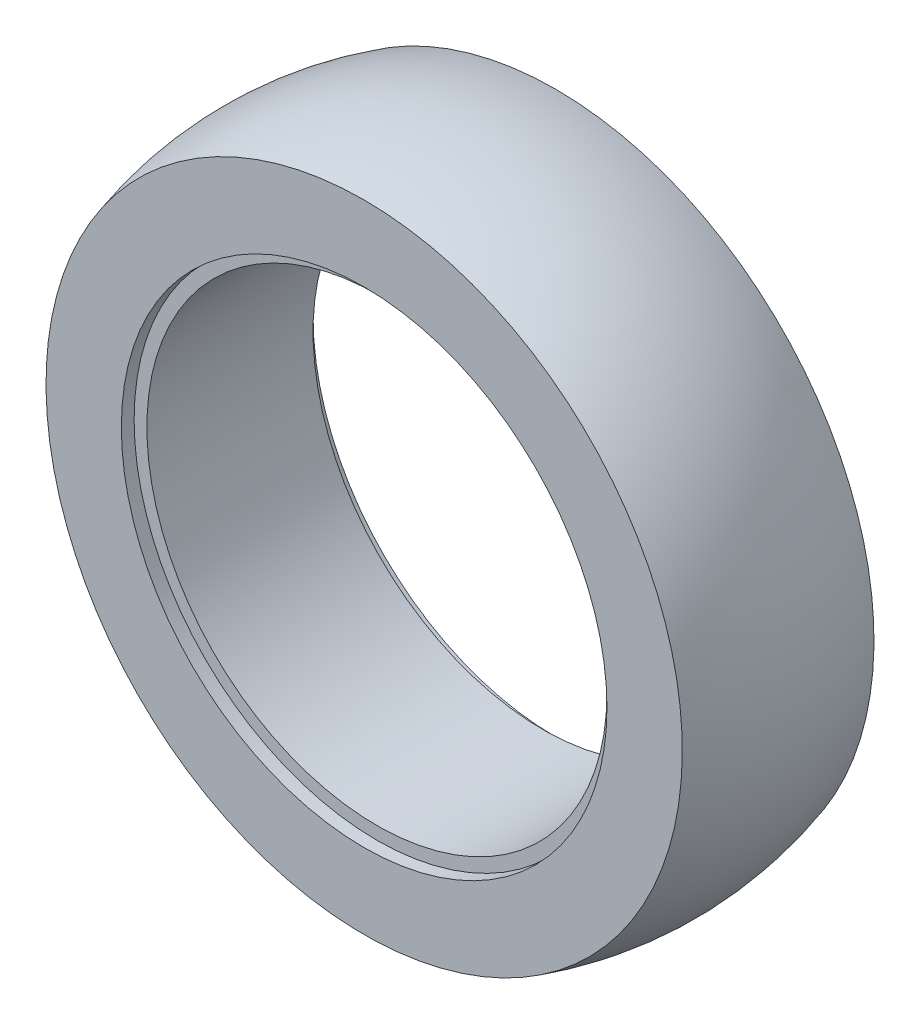
ISO-10303-21;
HEADER;
FILE_DESCRIPTION(('STEP AP214'),'2;1');
FILE_NAME('part.step','',(''),(''),'','','');
FILE_SCHEMA(('AUTOMOTIVE_DESIGN { 1 0 10303 214 1 1 1 1 }'));
ENDSEC;
DATA;
#1=APPLICATION_CONTEXT('core data for automotive mechanical design processes');
#2=APPLICATION_PROTOCOL_DEFINITION('international standard','automotive_design',2000,#1);
#3=PRODUCT_CONTEXT('',#1,'mechanical');
#4=PRODUCT('Part','Part','',(#3));
#5=PRODUCT_RELATED_PRODUCT_CATEGORY('part','',(#4));
#6=PRODUCT_DEFINITION_FORMATION('','',#4);
#7=PRODUCT_DEFINITION_CONTEXT('part definition',#1,'design');
#8=PRODUCT_DEFINITION('design','',#6,#7);
#9=PRODUCT_DEFINITION_SHAPE('','',#8);
#10=(LENGTH_UNIT() NAMED_UNIT(*) SI_UNIT(.MILLI.,.METRE.));
#11=(NAMED_UNIT(*) PLANE_ANGLE_UNIT() SI_UNIT($,.RADIAN.));
#12=(NAMED_UNIT(*) SI_UNIT($,.STERADIAN.) SOLID_ANGLE_UNIT());
#13=UNCERTAINTY_MEASURE_WITH_UNIT(LENGTH_MEASURE(1.E-05),#10,'distance_accuracy_value','');
#14=(GEOMETRIC_REPRESENTATION_CONTEXT(3) GLOBAL_UNCERTAINTY_ASSIGNED_CONTEXT((#13)) GLOBAL_UNIT_ASSIGNED_CONTEXT((#10,
#11,#12)) REPRESENTATION_CONTEXT('',''));
#15=CARTESIAN_POINT('',(0.,0.,0.));
#16=DIRECTION('',(0.,0.,1.));
#17=DIRECTION('',(1.,0.,0.));
#18=AXIS2_PLACEMENT_3D('',#15,#16,#17);
#19=CARTESIAN_POINT('',(0.,0.,0.));
#20=DIRECTION('',(0.,0.,0.999999999999999));
#21=DIRECTION('',(0.,1.,0.));
#22=AXIS2_PLACEMENT_3D('',#19,#20,#21);
#23=SPHERICAL_SURFACE('',#22,26.);
#24=CARTESIAN_POINT('',(0.,0.,7.49999999999995));
#25=DIRECTION('',(0.,0.,0.999999999999999));
#26=DIRECTION('',(1.,0.,0.));
#27=AXIS2_PLACEMENT_3D('',#24,#25,#26);
#28=CIRCLE('',#27,24.8947785690092);
#29=CARTESIAN_POINT('',(0.,24.8947785690092,7.49999999999995));
#30=VERTEX_POINT('',#29);
#31=EDGE_CURVE('E10',#30,#30,#28,.T.);
#32=CARTESIAN_POINT('',(0.,0.,-7.49999999999995));
#33=DIRECTION('',(0.,0.,0.999999999999999));
#34=DIRECTION('',(1.,0.,0.));
#35=AXIS2_PLACEMENT_3D('',#32,#33,#34);
#36=CIRCLE('',#35,24.8947785690092);
#37=CARTESIAN_POINT('',(0.,24.8947785690092,-7.49999999999995));
#38=VERTEX_POINT('',#37);
#39=EDGE_CURVE('E56',#38,#38,#36,.T.);
#40=CARTESIAN_POINT('',(0.,24.8947785690092,7.49999999999995));
#41=CARTESIAN_POINT('',(0.,24.9405005624031,7.34823541659987));
#42=CARTESIAN_POINT('',(0.,24.9848344356426,7.19605264278492));
#43=CARTESIAN_POINT('',(0.,25.0707118495896,6.89090182178894));
#44=CARTESIAN_POINT('',(0.,25.112255390297,6.73793377460791));
#45=CARTESIAN_POINT('',(0.,25.1925380469559,6.43126351434347));
#46=CARTESIAN_POINT('',(0.,25.2312771629074,6.27756130126005));
#47=CARTESIAN_POINT('',(0.,25.3059380658932,5.96947413258634));
#48=CARTESIAN_POINT('',(0.,25.3418598529275,5.81508917699606));
#49=CARTESIAN_POINT('',(0.,25.4108740692184,5.50568815620254));
#50=CARTESIAN_POINT('',(0.,25.4439664984751,5.35067209099931));
#51=CARTESIAN_POINT('',(0.,25.5073109346353,5.04006070001283));
#52=CARTESIAN_POINT('',(0.,25.5375629415389,4.88446537422957));
#53=CARTESIAN_POINT('',(0.,25.5952164136379,4.57274750350638));
#54=CARTESIAN_POINT('',(0.,25.6226178788333,4.41662495856644));
#55=CARTESIAN_POINT('',(0.,25.674561102866,4.10390486765412));
#56=CARTESIAN_POINT('',(0.,25.6991028617033,3.94730732168173));
#57=CARTESIAN_POINT('',(0.,25.7453184645055,3.63368960560432));
#58=CARTESIAN_POINT('',(0.,25.7669923084704,3.47666943549931));
#59=CARTESIAN_POINT('',(0.,25.8074648323331,3.16225898943693));
#60=CARTESIAN_POINT('',(0.,25.8262635122307,3.00486871347956));
#61=CARTESIAN_POINT('',(0.,25.8609794203904,2.68977069777443));
#62=CARTESIAN_POINT('',(0.,25.8768966486524,2.53206295802668));
#63=CARTESIAN_POINT('',(0.,25.9058443297334,2.21638276298621));
#64=CARTESIAN_POINT('',(0.,25.9188747825523,2.0584103076935));
#65=CARTESIAN_POINT('',(0.,25.9420445544729,1.74225351834703));
#66=CARTESIAN_POINT('',(0.,25.9521838735745,1.58406918429326));
#67=CARTESIAN_POINT('',(0.,25.9695679867793,1.26754154507543));
#68=CARTESIAN_POINT('',(0.,25.9768127808826,1.10919823991137));
#69=CARTESIAN_POINT('',(0.,25.9884054209364,0.792405619294494));
#70=CARTESIAN_POINT('',(0.,25.992753266887,0.633956303841675));
#71=CARTESIAN_POINT('',(0.,25.9985505564188,0.317004658925903));
#72=CARTESIAN_POINT('',(0.,26.,0.158502329462952));
#73=CARTESIAN_POINT('',(0.,26.,-0.158502329462952));
#74=CARTESIAN_POINT('',(0.,25.9985505564188,-0.317004658925903));
#75=CARTESIAN_POINT('',(0.,25.992753266887,-0.633956303841675));
#76=CARTESIAN_POINT('',(0.,25.9884054209364,-0.792405619294494));
#77=CARTESIAN_POINT('',(0.,25.9768127808826,-1.10919823991137));
#78=CARTESIAN_POINT('',(0.,25.9695679867793,-1.26754154507543));
#79=CARTESIAN_POINT('',(0.,25.9521838735745,-1.58406918429326));
#80=CARTESIAN_POINT('',(0.,25.9420445544729,-1.74225351834703));
#81=CARTESIAN_POINT('',(0.,25.9188747825523,-2.0584103076935));
#82=CARTESIAN_POINT('',(0.,25.9058443297334,-2.21638276298621));
#83=CARTESIAN_POINT('',(0.,25.8768966486524,-2.53206295802668));
#84=CARTESIAN_POINT('',(0.,25.8609794203904,-2.68977069777443));
#85=CARTESIAN_POINT('',(0.,25.8262635122307,-3.00486871347956));
#86=CARTESIAN_POINT('',(0.,25.8074648323331,-3.16225898943693));
#87=CARTESIAN_POINT('',(0.,25.7669923084704,-3.47666943549931));
#88=CARTESIAN_POINT('',(0.,25.7453184645055,-3.63368960560432));
#89=CARTESIAN_POINT('',(0.,25.6991028617033,-3.94730732168173));
#90=CARTESIAN_POINT('',(0.,25.674561102866,-4.10390486765412));
#91=CARTESIAN_POINT('',(0.,25.6226178788333,-4.41662495856644));
#92=CARTESIAN_POINT('',(0.,25.5952164136379,-4.57274750350638));
#93=CARTESIAN_POINT('',(0.,25.5375629415389,-4.88446537422957));
#94=CARTESIAN_POINT('',(0.,25.5073109346353,-5.04006070001283));
#95=CARTESIAN_POINT('',(0.,25.4439664984751,-5.35067209099931));
#96=CARTESIAN_POINT('',(0.,25.4108740692184,-5.50568815620254));
#97=CARTESIAN_POINT('',(0.,25.3418598529275,-5.81508917699606));
#98=CARTESIAN_POINT('',(0.,25.3059380658932,-5.96947413258634));
#99=CARTESIAN_POINT('',(0.,25.2312771629074,-6.27756130126005));
#100=CARTESIAN_POINT('',(0.,25.1925380469559,-6.43126351434347));
#101=CARTESIAN_POINT('',(0.,25.112255390297,-6.73793377460791));
#102=CARTESIAN_POINT('',(0.,25.0707118495896,-6.89090182178894));
#103=CARTESIAN_POINT('',(0.,24.9848344356426,-7.19605264278492));
#104=CARTESIAN_POINT('',(0.,24.9405005624031,-7.34823541659987));
#105=CARTESIAN_POINT('',(0.,24.8947785690092,-7.49999999999995));
#106=B_SPLINE_CURVE_WITH_KNOTS('',3,(#40,#41,#42,#43,#44,#45,#46,#47,#48,#49,#50,#51,#52,#53,
#54,#55,#56,#57,#58,#59,#60,#61,#62,#63,#64,#65,#66,#67,#68,#69,#70,#71,#72,#73,#74,#75,#76,#77,
#78,#79,#80,#81,#82,#83,#84,#85,#86,#87,#88,#89,#90,#91,#92,#93,#94,#95,#96,#97,#98,#99,#100,
#101,#102,#103,#104,#105),.UNSPECIFIED.,.F.,.F.,(4,2,2,2,2,2,2,2,2,2,2,2,2,2,2,2,2,2,2,2,2,2,2,
2,2,2,2,2,2,2,2,2,4),(0.,0.475500361776134,0.951000723552268,1.4265010853284,1.90200144710453,
2.37750180888067,2.8530021706568,3.32850253243294,3.80400289420907,4.2795032559852,
4.75500361776134,5.23050397953747,5.70600434131361,6.18150470308974,6.65700506486587,
7.132505426642,7.60800578841814,8.08350615019427,8.5590065119704,9.03450687374654,
9.51000723552267,9.98550759729881,10.4610079590749,10.9365083208511,11.4120086826272,
11.8875090444033,12.3630094061795,12.8385097679556,13.3140101297317,13.7895104915079,
14.265010853284,14.7405112150601,15.2160115768363),.UNSPECIFIED.);
#107=EDGE_CURVE('BSEAM28',#30,#38,#106,.T.);
#108=ORIENTED_EDGE('',*,*,#31,.F.);
#109=ORIENTED_EDGE('',*,*,#39,.T.);
#110=ORIENTED_EDGE('',*,*,#107,.T.);
#111=ORIENTED_EDGE('',*,*,#107,.F.);
#112=EDGE_LOOP('',(#108,#110,#109,#111));
#113=FACE_BOUND('',#112,.T.);
#114=ADVANCED_FACE('F28',(#113),#23,.T.);
#115=CARTESIAN_POINT('',(0.,19.,7.50000000000006));
#116=DIRECTION('',(0.,0.,-0.999999999999999));
#117=DIRECTION('',(-1.,0.,0.));
#118=AXIS2_PLACEMENT_3D('',#115,#116,#117);
#119=PLANE('',#118);
#120=CARTESIAN_POINT('',(0.,0.,7.49999999999995));
#121=DIRECTION('',(0.,0.,0.999999999999999));
#122=DIRECTION('',(1.,0.,0.));
#123=AXIS2_PLACEMENT_3D('',#120,#121,#122);
#124=CIRCLE('',#123,19.);
#125=CARTESIAN_POINT('',(19.,0.,7.49999999999995));
#126=VERTEX_POINT('',#125);
#127=EDGE_CURVE('E34',#126,#126,#124,.T.);
#128=ORIENTED_EDGE('',*,*,#127,.F.);
#129=EDGE_LOOP('',(#128));
#130=FACE_BOUND('',#129,.T.);
#131=ORIENTED_EDGE('',*,*,#31,.T.);
#132=EDGE_LOOP('',(#131));
#133=FACE_BOUND('',#132,.T.);
#134=ADVANCED_FACE('F93',(#130,#133),#119,.F.);
#135=CARTESIAN_POINT('',(0.,0.,2.46563750001905));
#136=DIRECTION('',(0.,0.,0.999999999999999));
#137=DIRECTION('',(1.,0.,0.));
#138=AXIS2_PLACEMENT_3D('',#135,#136,#137);
#139=CYLINDRICAL_SURFACE('',#138,19.);
#140=CARTESIAN_POINT('',(0.,0.,6.49999999999995));
#141=DIRECTION('',(0.,0.,0.999999999999999));
#142=DIRECTION('',(1.,0.,0.));
#143=AXIS2_PLACEMENT_3D('',#140,#141,#142);
#144=CIRCLE('',#143,19.);
#145=CARTESIAN_POINT('',(19.,0.,6.49999999999995));
#146=VERTEX_POINT('',#145);
#147=EDGE_CURVE('E38',#146,#146,#144,.T.);
#148=CARTESIAN_POINT('',(19.,0.,6.49999999999995));
#149=CARTESIAN_POINT('',(19.,0.,6.51041666666662));
#150=CARTESIAN_POINT('',(19.,0.,6.52083333333328));
#151=CARTESIAN_POINT('',(19.,0.,6.54166666666662));
#152=CARTESIAN_POINT('',(19.,0.,6.55208333333328));
#153=CARTESIAN_POINT('',(19.,0.,6.57291666666662));
#154=CARTESIAN_POINT('',(19.,0.,6.58333333333328));
#155=CARTESIAN_POINT('',(19.,0.,6.60416666666662));
#156=CARTESIAN_POINT('',(19.,0.,6.61458333333328));
#157=CARTESIAN_POINT('',(19.,0.,6.63541666666662));
#158=CARTESIAN_POINT('',(19.,0.,6.64583333333328));
#159=CARTESIAN_POINT('',(19.,0.,6.66666666666662));
#160=CARTESIAN_POINT('',(19.,0.,6.67708333333328));
#161=CARTESIAN_POINT('',(19.,0.,6.69791666666662));
#162=CARTESIAN_POINT('',(19.,0.,6.70833333333328));
#163=CARTESIAN_POINT('',(19.,0.,6.72916666666662));
#164=CARTESIAN_POINT('',(19.,0.,6.73958333333328));
#165=CARTESIAN_POINT('',(19.,0.,6.76041666666662));
#166=CARTESIAN_POINT('',(19.,0.,6.77083333333328));
#167=CARTESIAN_POINT('',(19.,0.,6.79166666666662));
#168=CARTESIAN_POINT('',(19.,0.,6.80208333333328));
#169=CARTESIAN_POINT('',(19.,0.,6.82291666666662));
#170=CARTESIAN_POINT('',(19.,0.,6.83333333333328));
#171=CARTESIAN_POINT('',(19.,0.,6.85416666666662));
#172=CARTESIAN_POINT('',(19.,0.,6.86458333333328));
#173=CARTESIAN_POINT('',(19.,0.,6.88541666666662));
#174=CARTESIAN_POINT('',(19.,0.,6.89583333333328));
#175=CARTESIAN_POINT('',(19.,0.,6.91666666666662));
#176=CARTESIAN_POINT('',(19.,0.,6.92708333333328));
#177=CARTESIAN_POINT('',(19.,0.,6.94791666666662));
#178=CARTESIAN_POINT('',(19.,0.,6.95833333333328));
#179=CARTESIAN_POINT('',(19.,0.,6.97916666666662));
#180=CARTESIAN_POINT('',(19.,0.,6.98958333333328));
#181=CARTESIAN_POINT('',(19.,0.,7.01041666666662));
#182=CARTESIAN_POINT('',(19.,0.,7.02083333333328));
#183=CARTESIAN_POINT('',(19.,0.,7.04166666666662));
#184=CARTESIAN_POINT('',(19.,0.,7.05208333333328));
#185=CARTESIAN_POINT('',(19.,0.,7.07291666666662));
#186=CARTESIAN_POINT('',(19.,0.,7.08333333333328));
#187=CARTESIAN_POINT('',(19.,0.,7.10416666666662));
#188=CARTESIAN_POINT('',(19.,0.,7.11458333333328));
#189=CARTESIAN_POINT('',(19.,0.,7.13541666666662));
#190=CARTESIAN_POINT('',(19.,0.,7.14583333333328));
#191=CARTESIAN_POINT('',(19.,0.,7.16666666666662));
#192=CARTESIAN_POINT('',(19.,0.,7.17708333333328));
#193=CARTESIAN_POINT('',(19.,0.,7.19791666666662));
#194=CARTESIAN_POINT('',(19.,0.,7.20833333333328));
#195=CARTESIAN_POINT('',(19.,0.,7.22916666666662));
#196=CARTESIAN_POINT('',(19.,0.,7.23958333333328));
#197=CARTESIAN_POINT('',(19.,0.,7.26041666666662));
#198=CARTESIAN_POINT('',(19.,0.,7.27083333333328));
#199=CARTESIAN_POINT('',(19.,0.,7.29166666666662));
#200=CARTESIAN_POINT('',(19.,0.,7.30208333333328));
#201=CARTESIAN_POINT('',(19.,0.,7.32291666666662));
#202=CARTESIAN_POINT('',(19.,0.,7.33333333333328));
#203=CARTESIAN_POINT('',(19.,0.,7.35416666666662));
#204=CARTESIAN_POINT('',(19.,0.,7.36458333333329));
#205=CARTESIAN_POINT('',(19.,0.,7.38541666666662));
#206=CARTESIAN_POINT('',(19.,0.,7.39583333333329));
#207=CARTESIAN_POINT('',(19.,0.,7.41666666666662));
#208=CARTESIAN_POINT('',(19.,0.,7.42708333333329));
#209=CARTESIAN_POINT('',(19.,0.,7.44791666666662));
#210=CARTESIAN_POINT('',(19.,0.,7.45833333333329));
#211=CARTESIAN_POINT('',(19.,0.,7.47916666666662));
#212=CARTESIAN_POINT('',(19.,0.,7.48958333333329));
#213=CARTESIAN_POINT('',(19.,0.,7.49999999999995));
#214=B_SPLINE_CURVE_WITH_KNOTS('',3,(#148,#149,#150,#151,#152,#153,#154,#155,#156,#157,#158,
#159,#160,#161,#162,#163,#164,#165,#166,#167,#168,#169,#170,#171,#172,#173,#174,#175,#176,#177,
#178,#179,#180,#181,#182,#183,#184,#185,#186,#187,#188,#189,#190,#191,#192,#193,#194,#195,#196,
#197,#198,#199,#200,#201,#202,#203,#204,#205,#206,#207,#208,#209,#210,#211,#212,#213),
.UNSPECIFIED.,.F.,.F.,(4,2,2,2,2,2,2,2,2,2,2,2,2,2,2,2,2,2,2,2,2,2,2,2,2,2,2,2,2,2,2,2,4),(0.,
0.03125,0.0625000000000001,0.0937500000000001,0.125,0.15625,0.1875,0.21875,0.25,
0.281250000000001,0.312500000000001,0.343750000000001,0.375000000000001,0.406250000000001,
0.437500000000001,0.468750000000001,0.500000000000001,0.53125,0.5625,0.593750000000001,
0.625000000000001,0.656250000000001,0.687500000000001,0.718750000000002,0.750000000000002,
0.781250000000002,0.812500000000002,0.843750000000002,0.875000000000002,0.906250000000002,
0.937500000000002,0.968750000000002,1.),.UNSPECIFIED.);
#215=EDGE_CURVE('BSEAM88',#146,#126,#214,.T.);
#216=ORIENTED_EDGE('',*,*,#147,.F.);
#217=ORIENTED_EDGE('',*,*,#127,.T.);
#218=ORIENTED_EDGE('',*,*,#215,.T.);
#219=ORIENTED_EDGE('',*,*,#215,.F.);
#220=EDGE_LOOP('',(#216,#218,#217,#219));
#221=FACE_BOUND('',#220,.T.);
#222=ADVANCED_FACE('F88',(#221),#139,.F.);
#223=CARTESIAN_POINT('',(-6.66133814775094E-13,18.0000000000002,6.50000000000006));
#224=DIRECTION('',(0.,0.,-0.999999999999999));
#225=DIRECTION('',(-1.,0.,0.));
#226=AXIS2_PLACEMENT_3D('',#223,#224,#225);
#227=PLANE('',#226);
#228=CARTESIAN_POINT('',(0.,0.,6.49999999999995));
#229=DIRECTION('',(0.,0.,0.999999999999999));
#230=DIRECTION('',(1.,0.,0.));
#231=AXIS2_PLACEMENT_3D('',#228,#229,#230);
#232=CIRCLE('',#231,18.);
#233=CARTESIAN_POINT('',(18.,0.,6.49999999999995));
#234=VERTEX_POINT('',#233);
#235=EDGE_CURVE('E42',#234,#234,#232,.T.);
#236=ORIENTED_EDGE('',*,*,#235,.F.);
#237=EDGE_LOOP('',(#236));
#238=FACE_BOUND('',#237,.T.);
#239=ORIENTED_EDGE('',*,*,#147,.T.);
#240=EDGE_LOOP('',(#239));
#241=FACE_BOUND('',#240,.T.);
#242=ADVANCED_FACE('F82',(#238,#241),#227,.F.);
#243=CARTESIAN_POINT('',(0.,0.,2.46563750001905));
#244=DIRECTION('',(0.,0.,0.999999999999999));
#245=DIRECTION('',(1.,0.,0.));
#246=AXIS2_PLACEMENT_3D('',#243,#244,#245);
#247=CYLINDRICAL_SURFACE('',#246,18.);
#248=CARTESIAN_POINT('',(0.,0.,-6.49999999999995));
#249=DIRECTION('',(0.,0.,0.999999999999999));
#250=DIRECTION('',(1.,0.,0.));
#251=AXIS2_PLACEMENT_3D('',#248,#249,#250);
#252=CIRCLE('',#251,18.);
#253=CARTESIAN_POINT('',(18.,0.,-6.49999999999995));
#254=VERTEX_POINT('',#253);
#255=EDGE_CURVE('E47',#254,#254,#252,.T.);
#256=CARTESIAN_POINT('',(18.,0.,-6.49999999999995));
#257=CARTESIAN_POINT('',(18.,0.,-6.36458333333329));
#258=CARTESIAN_POINT('',(18.,0.,-6.22916666666662));
#259=CARTESIAN_POINT('',(18.,0.,-5.95833333333329));
#260=CARTESIAN_POINT('',(18.,0.,-5.82291666666662));
#261=CARTESIAN_POINT('',(18.,0.,-5.55208333333329));
#262=CARTESIAN_POINT('',(18.,0.,-5.41666666666663));
#263=CARTESIAN_POINT('',(18.,0.,-5.14583333333329));
#264=CARTESIAN_POINT('',(18.,0.,-5.01041666666663));
#265=CARTESIAN_POINT('',(18.,0.,-4.7395833333333));
#266=CARTESIAN_POINT('',(18.,0.,-4.60416666666663));
#267=CARTESIAN_POINT('',(18.,0.,-4.3333333333333));
#268=CARTESIAN_POINT('',(18.,0.,-4.19791666666663));
#269=CARTESIAN_POINT('',(18.,0.,-3.9270833333333));
#270=CARTESIAN_POINT('',(18.,0.,-3.79166666666664));
#271=CARTESIAN_POINT('',(18.,0.,-3.52083333333331));
#272=CARTESIAN_POINT('',(18.,0.,-3.38541666666664));
#273=CARTESIAN_POINT('',(18.,0.,-3.11458333333331));
#274=CARTESIAN_POINT('',(18.,0.,-2.97916666666665));
#275=CARTESIAN_POINT('',(18.,0.,-2.70833333333331));
#276=CARTESIAN_POINT('',(18.,0.,-2.57291666666665));
#277=CARTESIAN_POINT('',(18.,0.,-2.30208333333332));
#278=CARTESIAN_POINT('',(18.,0.,-2.16666666666665));
#279=CARTESIAN_POINT('',(18.,0.,-1.89583333333332));
#280=CARTESIAN_POINT('',(18.,0.,-1.76041666666665));
#281=CARTESIAN_POINT('',(18.,0.,-1.48958333333332));
#282=CARTESIAN_POINT('',(18.,0.,-1.35416666666666));
#283=CARTESIAN_POINT('',(18.,0.,-1.08333333333333));
#284=CARTESIAN_POINT('',(18.,0.,-0.947916666666661));
#285=CARTESIAN_POINT('',(18.,0.,-0.677083333333329));
#286=CARTESIAN_POINT('',(18.,0.,-0.541666666666664));
#287=CARTESIAN_POINT('',(18.,0.,-0.270833333333332));
#288=CARTESIAN_POINT('',(18.,0.,-0.135416666666666));
#289=CARTESIAN_POINT('',(18.,0.,0.135416666666665));
#290=CARTESIAN_POINT('',(18.,0.,0.27083333333333));
#291=CARTESIAN_POINT('',(18.,0.,0.541666666666661));
#292=CARTESIAN_POINT('',(18.,0.,0.677083333333327));
#293=CARTESIAN_POINT('',(18.,0.,0.947916666666659));
#294=CARTESIAN_POINT('',(18.,0.,1.08333333333332));
#295=CARTESIAN_POINT('',(18.,0.,1.35416666666666));
#296=CARTESIAN_POINT('',(18.,0.,1.48958333333332));
#297=CARTESIAN_POINT('',(18.,0.,1.76041666666665));
#298=CARTESIAN_POINT('',(18.,0.,1.89583333333332));
#299=CARTESIAN_POINT('',(18.,0.,2.16666666666665));
#300=CARTESIAN_POINT('',(18.,0.,2.30208333333331));
#301=CARTESIAN_POINT('',(18.,0.,2.57291666666665));
#302=CARTESIAN_POINT('',(18.,0.,2.70833333333331));
#303=CARTESIAN_POINT('',(18.,0.,2.97916666666664));
#304=CARTESIAN_POINT('',(18.,0.,3.11458333333331));
#305=CARTESIAN_POINT('',(18.,0.,3.38541666666664));
#306=CARTESIAN_POINT('',(18.,0.,3.52083333333331));
#307=CARTESIAN_POINT('',(18.,0.,3.79166666666664));
#308=CARTESIAN_POINT('',(18.,0.,3.9270833333333));
#309=CARTESIAN_POINT('',(18.,0.,4.19791666666663));
#310=CARTESIAN_POINT('',(18.,0.,4.3333333333333));
#311=CARTESIAN_POINT('',(18.,0.,4.60416666666663));
#312=CARTESIAN_POINT('',(18.,0.,4.7395833333333));
#313=CARTESIAN_POINT('',(18.,0.,5.01041666666663));
#314=CARTESIAN_POINT('',(18.,0.,5.14583333333329));
#315=CARTESIAN_POINT('',(18.,0.,5.41666666666663));
#316=CARTESIAN_POINT('',(18.,0.,5.55208333333329));
#317=CARTESIAN_POINT('',(18.,0.,5.82291666666662));
#318=CARTESIAN_POINT('',(18.,0.,5.95833333333329));
#319=CARTESIAN_POINT('',(18.,0.,6.22916666666662));
#320=CARTESIAN_POINT('',(18.,0.,6.36458333333328));
#321=CARTESIAN_POINT('',(18.,0.,6.49999999999995));
#322=B_SPLINE_CURVE_WITH_KNOTS('',3,(#256,#257,#258,#259,#260,#261,#262,#263,#264,#265,#266,
#267,#268,#269,#270,#271,#272,#273,#274,#275,#276,#277,#278,#279,#280,#281,#282,#283,#284,#285,
#286,#287,#288,#289,#290,#291,#292,#293,#294,#295,#296,#297,#298,#299,#300,#301,#302,#303,#304,
#305,#306,#307,#308,#309,#310,#311,#312,#313,#314,#315,#316,#317,#318,#319,#320,#321),
.UNSPECIFIED.,.F.,.F.,(4,2,2,2,2,2,2,2,2,2,2,2,2,2,2,2,2,2,2,2,2,2,2,2,2,2,2,2,2,2,2,2,4),(0.,
0.406249999999997,0.812499999999994,1.21874999999999,1.62499999999999,2.03124999999999,
2.43749999999998,2.84374999999998,3.24999999999998,3.65624999999997,4.06249999999997,
4.46874999999997,4.87499999999996,5.28124999999996,5.68749999999996,6.09374999999995,
6.49999999999995,6.90624999999995,7.31249999999994,7.71874999999994,8.12499999999994,
8.53124999999993,8.93749999999993,9.34374999999993,9.74999999999993,10.1562499999999,
10.5624999999999,10.9687499999999,11.3749999999999,11.7812499999999,12.1874999999999,
12.5937499999999,12.9999999999999),.UNSPECIFIED.);
#323=EDGE_CURVE('BSEAM76',#254,#234,#322,.T.);
#324=ORIENTED_EDGE('',*,*,#255,.F.);
#325=ORIENTED_EDGE('',*,*,#235,.T.);
#326=ORIENTED_EDGE('',*,*,#323,.T.);
#327=ORIENTED_EDGE('',*,*,#323,.F.);
#328=EDGE_LOOP('',(#324,#326,#325,#327));
#329=FACE_BOUND('',#328,.T.);
#330=ADVANCED_FACE('F76',(#329),#247,.F.);
#331=CARTESIAN_POINT('',(-6.66133814775094E-13,19.0000000000002,-6.49999999999995));
#332=DIRECTION('',(0.,0.,0.999999999999999));
#333=DIRECTION('',(1.,0.,0.));
#334=AXIS2_PLACEMENT_3D('',#331,#332,#333);
#335=PLANE('',#334);
#336=CARTESIAN_POINT('',(0.,0.,-6.49999999999995));
#337=DIRECTION('',(0.,0.,0.999999999999999));
#338=DIRECTION('',(1.,0.,0.));
#339=AXIS2_PLACEMENT_3D('',#336,#337,#338);
#340=CIRCLE('',#339,19.);
#341=CARTESIAN_POINT('',(19.,0.,-6.49999999999995));
#342=VERTEX_POINT('',#341);
#343=EDGE_CURVE('E50',#342,#342,#340,.T.);
#344=ORIENTED_EDGE('',*,*,#343,.F.);
#345=EDGE_LOOP('',(#344));
#346=FACE_BOUND('',#345,.T.);
#347=ORIENTED_EDGE('',*,*,#255,.T.);
#348=EDGE_LOOP('',(#347));
#349=FACE_BOUND('',#348,.T.);
#350=ADVANCED_FACE('F70',(#346,#349),#335,.F.);
#351=CARTESIAN_POINT('',(0.,0.,2.46563750001905));
#352=DIRECTION('',(0.,0.,0.999999999999999));
#353=DIRECTION('',(1.,0.,0.));
#354=AXIS2_PLACEMENT_3D('',#351,#352,#353);
#355=CYLINDRICAL_SURFACE('',#354,19.);
#356=CARTESIAN_POINT('',(0.,0.,-7.49999999999995));
#357=DIRECTION('',(0.,0.,0.999999999999999));
#358=DIRECTION('',(1.,0.,0.));
#359=AXIS2_PLACEMENT_3D('',#356,#357,#358);
#360=CIRCLE('',#359,19.);
#361=CARTESIAN_POINT('',(19.,0.,-7.49999999999995));
#362=VERTEX_POINT('',#361);
#363=EDGE_CURVE('E53',#362,#362,#360,.T.);
#364=CARTESIAN_POINT('',(19.,0.,-7.49999999999995));
#365=CARTESIAN_POINT('',(19.,0.,-7.48958333333329));
#366=CARTESIAN_POINT('',(19.,0.,-7.47916666666662));
#367=CARTESIAN_POINT('',(19.,0.,-7.45833333333329));
#368=CARTESIAN_POINT('',(19.,0.,-7.44791666666662));
#369=CARTESIAN_POINT('',(19.,0.,-7.42708333333329));
#370=CARTESIAN_POINT('',(19.,0.,-7.41666666666662));
#371=CARTESIAN_POINT('',(19.,0.,-7.39583333333329));
#372=CARTESIAN_POINT('',(19.,0.,-7.38541666666662));
#373=CARTESIAN_POINT('',(19.,0.,-7.36458333333329));
#374=CARTESIAN_POINT('',(19.,0.,-7.35416666666662));
#375=CARTESIAN_POINT('',(19.,0.,-7.33333333333328));
#376=CARTESIAN_POINT('',(19.,0.,-7.32291666666662));
#377=CARTESIAN_POINT('',(19.,0.,-7.30208333333328));
#378=CARTESIAN_POINT('',(19.,0.,-7.29166666666662));
#379=CARTESIAN_POINT('',(19.,0.,-7.27083333333328));
#380=CARTESIAN_POINT('',(19.,0.,-7.26041666666662));
#381=CARTESIAN_POINT('',(19.,0.,-7.23958333333328));
#382=CARTESIAN_POINT('',(19.,0.,-7.22916666666662));
#383=CARTESIAN_POINT('',(19.,0.,-7.20833333333328));
#384=CARTESIAN_POINT('',(19.,0.,-7.19791666666662));
#385=CARTESIAN_POINT('',(19.,0.,-7.17708333333328));
#386=CARTESIAN_POINT('',(19.,0.,-7.16666666666662));
#387=CARTESIAN_POINT('',(19.,0.,-7.14583333333328));
#388=CARTESIAN_POINT('',(19.,0.,-7.13541666666662));
#389=CARTESIAN_POINT('',(19.,0.,-7.11458333333328));
#390=CARTESIAN_POINT('',(19.,0.,-7.10416666666662));
#391=CARTESIAN_POINT('',(19.,0.,-7.08333333333328));
#392=CARTESIAN_POINT('',(19.,0.,-7.07291666666662));
#393=CARTESIAN_POINT('',(19.,0.,-7.05208333333328));
#394=CARTESIAN_POINT('',(19.,0.,-7.04166666666662));
#395=CARTESIAN_POINT('',(19.,0.,-7.02083333333328));
#396=CARTESIAN_POINT('',(19.,0.,-7.01041666666662));
#397=CARTESIAN_POINT('',(19.,0.,-6.98958333333328));
#398=CARTESIAN_POINT('',(19.,0.,-6.97916666666662));
#399=CARTESIAN_POINT('',(19.,0.,-6.95833333333328));
#400=CARTESIAN_POINT('',(19.,0.,-6.94791666666662));
#401=CARTESIAN_POINT('',(19.,0.,-6.92708333333328));
#402=CARTESIAN_POINT('',(19.,0.,-6.91666666666662));
#403=CARTESIAN_POINT('',(19.,0.,-6.89583333333328));
#404=CARTESIAN_POINT('',(19.,0.,-6.88541666666662));
#405=CARTESIAN_POINT('',(19.,0.,-6.86458333333328));
#406=CARTESIAN_POINT('',(19.,0.,-6.85416666666662));
#407=CARTESIAN_POINT('',(19.,0.,-6.83333333333328));
#408=CARTESIAN_POINT('',(19.,0.,-6.82291666666662));
#409=CARTESIAN_POINT('',(19.,0.,-6.80208333333328));
#410=CARTESIAN_POINT('',(19.,0.,-6.79166666666662));
#411=CARTESIAN_POINT('',(19.,0.,-6.77083333333328));
#412=CARTESIAN_POINT('',(19.,0.,-6.76041666666662));
#413=CARTESIAN_POINT('',(19.,0.,-6.73958333333328));
#414=CARTESIAN_POINT('',(19.,0.,-6.72916666666662));
#415=CARTESIAN_POINT('',(19.,0.,-6.70833333333328));
#416=CARTESIAN_POINT('',(19.,0.,-6.69791666666662));
#417=CARTESIAN_POINT('',(19.,0.,-6.67708333333328));
#418=CARTESIAN_POINT('',(19.,0.,-6.66666666666662));
#419=CARTESIAN_POINT('',(19.,0.,-6.64583333333328));
#420=CARTESIAN_POINT('',(19.,0.,-6.63541666666662));
#421=CARTESIAN_POINT('',(19.,0.,-6.61458333333329));
#422=CARTESIAN_POINT('',(19.,0.,-6.60416666666662));
#423=CARTESIAN_POINT('',(19.,0.,-6.58333333333329));
#424=CARTESIAN_POINT('',(19.,0.,-6.57291666666662));
#425=CARTESIAN_POINT('',(19.,0.,-6.55208333333329));
#426=CARTESIAN_POINT('',(19.,0.,-6.54166666666662));
#427=CARTESIAN_POINT('',(19.,0.,-6.52083333333329));
#428=CARTESIAN_POINT('',(19.,0.,-6.51041666666662));
#429=CARTESIAN_POINT('',(19.,0.,-6.49999999999995));
#430=B_SPLINE_CURVE_WITH_KNOTS('',3,(#364,#365,#366,#367,#368,#369,#370,#371,#372,#373,#374,
#375,#376,#377,#378,#379,#380,#381,#382,#383,#384,#385,#386,#387,#388,#389,#390,#391,#392,#393,
#394,#395,#396,#397,#398,#399,#400,#401,#402,#403,#404,#405,#406,#407,#408,#409,#410,#411,#412,
#413,#414,#415,#416,#417,#418,#419,#420,#421,#422,#423,#424,#425,#426,#427,#428,#429),
.UNSPECIFIED.,.F.,.F.,(4,2,2,2,2,2,2,2,2,2,2,2,2,2,2,2,2,2,2,2,2,2,2,2,2,2,2,2,2,2,2,2,4),(0.,
0.03125,0.0625000000000001,0.0937500000000001,0.125,0.15625,0.1875,0.21875,0.25,0.28125,0.3125,
0.34375,0.375,0.40625,0.4375,0.46875,0.5,0.53125,0.5625,0.593750000000001,0.625000000000001,
0.656250000000001,0.687500000000001,0.718750000000001,0.750000000000001,0.781250000000001,
0.812500000000001,0.843750000000001,0.874999999999999,0.906249999999999,0.937499999999999,
0.968749999999999,0.999999999999999),.UNSPECIFIED.);
#431=EDGE_CURVE('BSEAM64',#362,#342,#430,.T.);
#432=ORIENTED_EDGE('',*,*,#363,.F.);
#433=ORIENTED_EDGE('',*,*,#343,.T.);
#434=ORIENTED_EDGE('',*,*,#431,.T.);
#435=ORIENTED_EDGE('',*,*,#431,.F.);
#436=EDGE_LOOP('',(#432,#434,#433,#435));
#437=FACE_BOUND('',#436,.T.);
#438=ADVANCED_FACE('F64',(#437),#355,.F.);
#439=CARTESIAN_POINT('',(-6.66133814775094E-13,19.0000000000002,-7.49999999999995));
#440=DIRECTION('',(0.,0.,0.999999999999999));
#441=DIRECTION('',(1.,0.,0.));
#442=AXIS2_PLACEMENT_3D('',#439,#440,#441);
#443=PLANE('',#442);
#444=ORIENTED_EDGE('',*,*,#39,.F.);
#445=EDGE_LOOP('',(#444));
#446=FACE_BOUND('',#445,.T.);
#447=ORIENTED_EDGE('',*,*,#363,.T.);
#448=EDGE_LOOP('',(#447));
#449=FACE_BOUND('',#448,.T.);
#450=ADVANCED_FACE('F61',(#446,#449),#443,.F.);
#451=CLOSED_SHELL('',(#114,#134,#222,#242,#330,#350,#438,#450));
#452=MANIFOLD_SOLID_BREP('B2',#451);
#453=ADVANCED_BREP_SHAPE_REPRESENTATION('',(#18,#452),#14);
#454=SHAPE_DEFINITION_REPRESENTATION(#9,#453);
ENDSEC;
END-ISO-10303-21;
